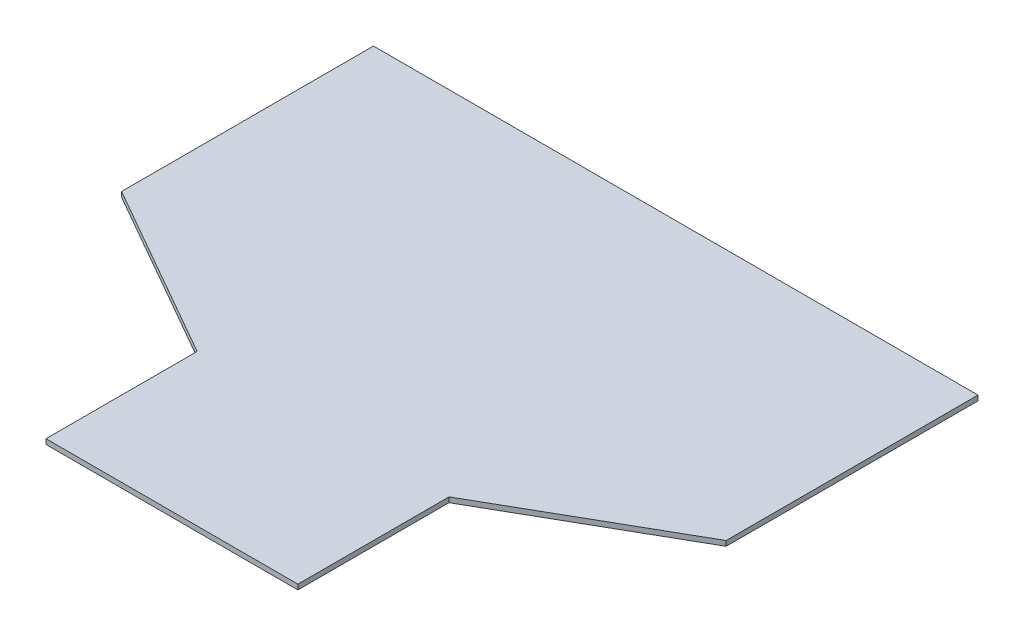
ISO-10303-21;
HEADER;
FILE_DESCRIPTION(('STEP AP214'),'2;1');
FILE_NAME('part.step','',(''),(''),'','','');
FILE_SCHEMA(('AUTOMOTIVE_DESIGN { 1 0 10303 214 1 1 1 1 }'));
ENDSEC;
DATA;
#1=APPLICATION_CONTEXT('core data for automotive mechanical design processes');
#2=APPLICATION_PROTOCOL_DEFINITION('international standard','automotive_design',2000,#1);
#3=PRODUCT_CONTEXT('',#1,'mechanical');
#4=PRODUCT('Part','Part','',(#3));
#5=PRODUCT_RELATED_PRODUCT_CATEGORY('part','',(#4));
#6=PRODUCT_DEFINITION_FORMATION('','',#4);
#7=PRODUCT_DEFINITION_CONTEXT('part definition',#1,'design');
#8=PRODUCT_DEFINITION('design','',#6,#7);
#9=PRODUCT_DEFINITION_SHAPE('','',#8);
#10=(LENGTH_UNIT() NAMED_UNIT(*) SI_UNIT(.MILLI.,.METRE.));
#11=(NAMED_UNIT(*) PLANE_ANGLE_UNIT() SI_UNIT($,.RADIAN.));
#12=(NAMED_UNIT(*) SI_UNIT($,.STERADIAN.) SOLID_ANGLE_UNIT());
#13=UNCERTAINTY_MEASURE_WITH_UNIT(LENGTH_MEASURE(1.E-05),#10,'distance_accuracy_value','');
#14=(GEOMETRIC_REPRESENTATION_CONTEXT(3) GLOBAL_UNCERTAINTY_ASSIGNED_CONTEXT((#13)) GLOBAL_UNIT_ASSIGNED_CONTEXT((#10,
#11,#12)) REPRESENTATION_CONTEXT('',''));
#15=CARTESIAN_POINT('',(0.,0.,0.));
#16=DIRECTION('',(0.,0.,1.));
#17=DIRECTION('',(1.,0.,0.));
#18=AXIS2_PLACEMENT_3D('',#15,#16,#17);
#19=CARTESIAN_POINT('',(-152.4,2.54,127.));
#20=DIRECTION('',(0.496138938356834,0.,-0.868243142124459));
#21=DIRECTION('',(-0.868243142124459,0.,-0.496138938356834));
#22=AXIS2_PLACEMENT_3D('',#19,#20,#21);
#23=PLANE('',#22);
#24=DIRECTION('',(0.868243142124459,0.,0.496138938356834));
#25=VECTOR('',#24,1.);
#26=CARTESIAN_POINT('',(-152.4,0.,127.));
#27=LINE('',#26,#25);
#28=CARTESIAN_POINT('',(-152.4,0.,127.));
#29=VERTEX_POINT('',#28);
#30=CARTESIAN_POINT('',(-63.5,0.,177.8));
#31=VERTEX_POINT('',#30);
#32=EDGE_CURVE('E129',#29,#31,#27,.T.);
#33=ORIENTED_EDGE('',*,*,#32,.T.);
#34=DIRECTION('',(0.,-1.,0.));
#35=VECTOR('',#34,1.);
#36=CARTESIAN_POINT('',(-63.5,2.54,177.8));
#37=LINE('',#36,#35);
#38=CARTESIAN_POINT('',(-63.5,2.54,177.8));
#39=VERTEX_POINT('',#38);
#40=EDGE_CURVE('E11',#39,#31,#37,.T.);
#41=ORIENTED_EDGE('',*,*,#40,.F.);
#42=DIRECTION('',(0.868243142124459,0.,0.496138938356834));
#43=VECTOR('',#42,1.);
#44=CARTESIAN_POINT('',(-152.4,2.54,127.));
#45=LINE('',#44,#43);
#46=CARTESIAN_POINT('',(-152.4,2.54,127.));
#47=VERTEX_POINT('',#46);
#48=EDGE_CURVE('E143',#47,#39,#45,.T.);
#49=ORIENTED_EDGE('',*,*,#48,.F.);
#50=DIRECTION('',(0.,-1.,0.));
#51=VECTOR('',#50,1.);
#52=CARTESIAN_POINT('',(-152.4,2.54,127.));
#53=LINE('',#52,#51);
#54=EDGE_CURVE('E125',#47,#29,#53,.T.);
#55=ORIENTED_EDGE('',*,*,#54,.T.);
#56=EDGE_LOOP('',(#33,#41,#49,#55));
#57=FACE_BOUND('',#56,.T.);
#58=ADVANCED_FACE('F33',(#57),#23,.F.);
#59=CARTESIAN_POINT('',(-63.5,2.54,177.8));
#60=DIRECTION('',(1.,0.,0.));
#61=DIRECTION('',(0.,0.,-1.));
#62=AXIS2_PLACEMENT_3D('',#59,#60,#61);
#63=PLANE('',#62);
#64=DIRECTION('',(0.,0.,1.));
#65=VECTOR('',#64,1.);
#66=CARTESIAN_POINT('',(-63.5,0.,177.8));
#67=LINE('',#66,#65);
#68=CARTESIAN_POINT('',(-63.5,0.,254.));
#69=VERTEX_POINT('',#68);
#70=EDGE_CURVE('E132',#31,#69,#67,.T.);
#71=ORIENTED_EDGE('',*,*,#70,.T.);
#72=DIRECTION('',(0.,-1.,0.));
#73=VECTOR('',#72,1.);
#74=CARTESIAN_POINT('',(-63.5,2.54,254.));
#75=LINE('',#74,#73);
#76=CARTESIAN_POINT('',(-63.5,2.54,254.));
#77=VERTEX_POINT('',#76);
#78=EDGE_CURVE('E41',#77,#69,#75,.T.);
#79=ORIENTED_EDGE('',*,*,#78,.F.);
#80=DIRECTION('',(0.,0.,1.));
#81=VECTOR('',#80,1.);
#82=CARTESIAN_POINT('',(-63.5,2.54,177.8));
#83=LINE('',#82,#81);
#84=EDGE_CURVE('E92',#39,#77,#83,.T.);
#85=ORIENTED_EDGE('',*,*,#84,.F.);
#86=ORIENTED_EDGE('',*,*,#40,.T.);
#87=EDGE_LOOP('',(#71,#79,#85,#86));
#88=FACE_BOUND('',#87,.T.);
#89=ADVANCED_FACE('F178',(#88),#63,.F.);
#90=CARTESIAN_POINT('',(-63.5,2.54,254.));
#91=DIRECTION('',(0.,0.,-1.));
#92=DIRECTION('',(-1.,0.,0.));
#93=AXIS2_PLACEMENT_3D('',#90,#91,#92);
#94=PLANE('',#93);
#95=DIRECTION('',(1.,0.,0.));
#96=VECTOR('',#95,1.);
#97=CARTESIAN_POINT('',(-63.5,0.,254.));
#98=LINE('',#97,#96);
#99=CARTESIAN_POINT('',(63.5000000000001,0.,254.));
#100=VERTEX_POINT('',#99);
#101=EDGE_CURVE('E134',#69,#100,#98,.T.);
#102=ORIENTED_EDGE('',*,*,#101,.T.);
#103=DIRECTION('',(0.,-1.,0.));
#104=VECTOR('',#103,1.);
#105=CARTESIAN_POINT('',(63.5000000000001,2.54,254.));
#106=LINE('',#105,#104);
#107=CARTESIAN_POINT('',(63.5000000000001,2.54,254.));
#108=VERTEX_POINT('',#107);
#109=EDGE_CURVE('E150',#108,#100,#106,.T.);
#110=ORIENTED_EDGE('',*,*,#109,.F.);
#111=DIRECTION('',(1.,0.,0.));
#112=VECTOR('',#111,1.);
#113=CARTESIAN_POINT('',(-63.5,2.54,254.));
#114=LINE('',#113,#112);
#115=EDGE_CURVE('E158',#77,#108,#114,.T.);
#116=ORIENTED_EDGE('',*,*,#115,.F.);
#117=ORIENTED_EDGE('',*,*,#78,.T.);
#118=EDGE_LOOP('',(#102,#110,#116,#117));
#119=FACE_BOUND('',#118,.T.);
#120=ADVANCED_FACE('F156',(#119),#94,.F.);
#121=CARTESIAN_POINT('',(63.5000000000001,2.54,254.));
#122=DIRECTION('',(-1.,0.,0.));
#123=DIRECTION('',(0.,0.,1.));
#124=AXIS2_PLACEMENT_3D('',#121,#122,#123);
#125=PLANE('',#124);
#126=DIRECTION('',(0.,0.,-1.));
#127=VECTOR('',#126,1.);
#128=CARTESIAN_POINT('',(63.5000000000001,0.,254.));
#129=LINE('',#128,#127);
#130=CARTESIAN_POINT('',(63.5000000000001,0.,177.8));
#131=VERTEX_POINT('',#130);
#132=EDGE_CURVE('E136',#100,#131,#129,.T.);
#133=ORIENTED_EDGE('',*,*,#132,.T.);
#134=DIRECTION('',(0.,-1.,0.));
#135=VECTOR('',#134,1.);
#136=CARTESIAN_POINT('',(63.5000000000001,2.54,177.8));
#137=LINE('',#136,#135);
#138=CARTESIAN_POINT('',(63.5000000000001,2.54,177.8));
#139=VERTEX_POINT('',#138);
#140=EDGE_CURVE('E147',#139,#131,#137,.T.);
#141=ORIENTED_EDGE('',*,*,#140,.F.);
#142=DIRECTION('',(0.,0.,-1.));
#143=VECTOR('',#142,1.);
#144=CARTESIAN_POINT('',(63.5000000000001,2.54,254.));
#145=LINE('',#144,#143);
#146=EDGE_CURVE('E170',#108,#139,#145,.T.);
#147=ORIENTED_EDGE('',*,*,#146,.F.);
#148=ORIENTED_EDGE('',*,*,#109,.T.);
#149=EDGE_LOOP('',(#133,#141,#147,#148));
#150=FACE_BOUND('',#149,.T.);
#151=ADVANCED_FACE('F166',(#150),#125,.F.);
#152=CARTESIAN_POINT('',(63.5000000000001,2.54,177.8));
#153=DIRECTION('',(-0.496138938356834,0.,-0.868243142124459));
#154=DIRECTION('',(-0.868243142124459,0.,0.496138938356834));
#155=AXIS2_PLACEMENT_3D('',#152,#153,#154);
#156=PLANE('',#155);
#157=DIRECTION('',(0.868243142124459,0.,-0.496138938356834));
#158=VECTOR('',#157,1.);
#159=CARTESIAN_POINT('',(63.5000000000001,0.,177.8));
#160=LINE('',#159,#158);
#161=CARTESIAN_POINT('',(152.4,0.,127.));
#162=VERTEX_POINT('',#161);
#163=EDGE_CURVE('E138',#131,#162,#160,.T.);
#164=ORIENTED_EDGE('',*,*,#163,.T.);
#165=DIRECTION('',(0.,-1.,0.));
#166=VECTOR('',#165,1.);
#167=CARTESIAN_POINT('',(152.4,2.54,127.));
#168=LINE('',#167,#166);
#169=CARTESIAN_POINT('',(152.4,2.54,127.));
#170=VERTEX_POINT('',#169);
#171=EDGE_CURVE('E120',#170,#162,#168,.T.);
#172=ORIENTED_EDGE('',*,*,#171,.F.);
#173=DIRECTION('',(0.868243142124459,0.,-0.496138938356834));
#174=VECTOR('',#173,1.);
#175=CARTESIAN_POINT('',(63.5000000000001,2.54,177.8));
#176=LINE('',#175,#174);
#177=EDGE_CURVE('E111',#139,#170,#176,.T.);
#178=ORIENTED_EDGE('',*,*,#177,.F.);
#179=ORIENTED_EDGE('',*,*,#140,.T.);
#180=EDGE_LOOP('',(#164,#172,#178,#179));
#181=FACE_BOUND('',#180,.T.);
#182=ADVANCED_FACE('F169',(#181),#156,.F.);
#183=CARTESIAN_POINT('',(152.4,2.54,127.));
#184=DIRECTION('',(-1.,0.,0.));
#185=DIRECTION('',(0.,0.,1.));
#186=AXIS2_PLACEMENT_3D('',#183,#184,#185);
#187=PLANE('',#186);
#188=DIRECTION('',(0.,0.,-1.));
#189=VECTOR('',#188,1.);
#190=CARTESIAN_POINT('',(152.4,0.,127.));
#191=LINE('',#190,#189);
#192=CARTESIAN_POINT('',(152.4,0.,0.));
#193=VERTEX_POINT('',#192);
#194=EDGE_CURVE('E119',#162,#193,#191,.T.);
#195=ORIENTED_EDGE('',*,*,#194,.T.);
#196=DIRECTION('',(0.,-1.,0.));
#197=VECTOR('',#196,1.);
#198=CARTESIAN_POINT('',(152.4,2.54,0.));
#199=LINE('',#198,#197);
#200=CARTESIAN_POINT('',(152.4,2.54,0.));
#201=VERTEX_POINT('',#200);
#202=EDGE_CURVE('E116',#201,#193,#199,.T.);
#203=ORIENTED_EDGE('',*,*,#202,.F.);
#204=DIRECTION('',(0.,0.,-1.));
#205=VECTOR('',#204,1.);
#206=CARTESIAN_POINT('',(152.4,2.54,127.));
#207=LINE('',#206,#205);
#208=EDGE_CURVE('E105',#170,#201,#207,.T.);
#209=ORIENTED_EDGE('',*,*,#208,.F.);
#210=ORIENTED_EDGE('',*,*,#171,.T.);
#211=EDGE_LOOP('',(#195,#203,#209,#210));
#212=FACE_BOUND('',#211,.T.);
#213=ADVANCED_FACE('F117',(#212),#187,.F.);
#214=CARTESIAN_POINT('',(-152.4,2.54,0.));
#215=DIRECTION('',(0.,0.,1.));
#216=DIRECTION('',(1.,0.,0.));
#217=AXIS2_PLACEMENT_3D('',#214,#215,#216);
#218=PLANE('',#217);
#219=DIRECTION('',(-1.,0.,0.));
#220=VECTOR('',#219,1.);
#221=CARTESIAN_POINT('',(-152.4,0.,0.));
#222=LINE('',#221,#220);
#223=CARTESIAN_POINT('',(-152.4,0.,0.));
#224=VERTEX_POINT('',#223);
#225=EDGE_CURVE('E78',#193,#224,#222,.T.);
#226=ORIENTED_EDGE('',*,*,#225,.T.);
#227=DIRECTION('',(0.,-1.,0.));
#228=VECTOR('',#227,1.);
#229=CARTESIAN_POINT('',(-152.4,2.54,0.));
#230=LINE('',#229,#228);
#231=CARTESIAN_POINT('',(-152.4,2.54,0.));
#232=VERTEX_POINT('',#231);
#233=EDGE_CURVE('E121',#232,#224,#230,.T.);
#234=ORIENTED_EDGE('',*,*,#233,.F.);
#235=DIRECTION('',(-1.,0.,0.));
#236=VECTOR('',#235,1.);
#237=CARTESIAN_POINT('',(-152.4,2.54,0.));
#238=LINE('',#237,#236);
#239=EDGE_CURVE('E109',#201,#232,#238,.T.);
#240=ORIENTED_EDGE('',*,*,#239,.F.);
#241=ORIENTED_EDGE('',*,*,#202,.T.);
#242=EDGE_LOOP('',(#226,#234,#240,#241));
#243=FACE_BOUND('',#242,.T.);
#244=ADVANCED_FACE('F123',(#243),#218,.F.);
#245=CARTESIAN_POINT('',(-152.4,2.54,0.));
#246=DIRECTION('',(1.,0.,0.));
#247=DIRECTION('',(0.,0.,-1.));
#248=AXIS2_PLACEMENT_3D('',#245,#246,#247);
#249=PLANE('',#248);
#250=DIRECTION('',(0.,0.,1.));
#251=VECTOR('',#250,1.);
#252=CARTESIAN_POINT('',(-152.4,0.,0.));
#253=LINE('',#252,#251);
#254=EDGE_CURVE('E84',#224,#29,#253,.T.);
#255=ORIENTED_EDGE('',*,*,#254,.T.);
#256=ORIENTED_EDGE('',*,*,#54,.F.);
#257=DIRECTION('',(0.,0.,1.));
#258=VECTOR('',#257,1.);
#259=CARTESIAN_POINT('',(-152.4,2.54,0.));
#260=LINE('',#259,#258);
#261=EDGE_CURVE('E49',#232,#47,#260,.T.);
#262=ORIENTED_EDGE('',*,*,#261,.F.);
#263=ORIENTED_EDGE('',*,*,#233,.T.);
#264=EDGE_LOOP('',(#255,#256,#262,#263));
#265=FACE_BOUND('',#264,.T.);
#266=ADVANCED_FACE('F194',(#265),#249,.F.);
#267=CARTESIAN_POINT('',(0.,2.54,0.));
#268=DIRECTION('',(0.,-1.,0.));
#269=DIRECTION('',(0.,0.,-1.));
#270=AXIS2_PLACEMENT_3D('',#267,#268,#269);
#271=PLANE('',#270);
#272=ORIENTED_EDGE('',*,*,#48,.T.);
#273=ORIENTED_EDGE('',*,*,#84,.T.);
#274=ORIENTED_EDGE('',*,*,#115,.T.);
#275=ORIENTED_EDGE('',*,*,#146,.T.);
#276=ORIENTED_EDGE('',*,*,#177,.T.);
#277=ORIENTED_EDGE('',*,*,#208,.T.);
#278=ORIENTED_EDGE('',*,*,#239,.T.);
#279=ORIENTED_EDGE('',*,*,#261,.T.);
#280=EDGE_LOOP('',(#272,#273,#274,#275,#276,#277,#278,#279));
#281=FACE_BOUND('',#280,.T.);
#282=ADVANCED_FACE('F107',(#281),#271,.F.);
#283=CARTESIAN_POINT('',(0.,0.,0.));
#284=DIRECTION('',(0.,-1.,0.));
#285=DIRECTION('',(0.,0.,-1.));
#286=AXIS2_PLACEMENT_3D('',#283,#284,#285);
#287=PLANE('',#286);
#288=ORIENTED_EDGE('',*,*,#32,.F.);
#289=ORIENTED_EDGE('',*,*,#254,.F.);
#290=ORIENTED_EDGE('',*,*,#225,.F.);
#291=ORIENTED_EDGE('',*,*,#194,.F.);
#292=ORIENTED_EDGE('',*,*,#163,.F.);
#293=ORIENTED_EDGE('',*,*,#132,.F.);
#294=ORIENTED_EDGE('',*,*,#101,.F.);
#295=ORIENTED_EDGE('',*,*,#70,.F.);
#296=EDGE_LOOP('',(#288,#289,#290,#291,#292,#293,#294,#295));
#297=FACE_BOUND('',#296,.T.);
#298=ADVANCED_FACE('F162',(#297),#287,.T.);
#299=CLOSED_SHELL('',(#58,#89,#120,#151,#182,#213,#244,#266,#282,#298));
#300=MANIFOLD_SOLID_BREP('B2',#299);
#301=ADVANCED_BREP_SHAPE_REPRESENTATION('',(#18,#300),#14);
#302=SHAPE_DEFINITION_REPRESENTATION(#9,#301);
ENDSEC;
END-ISO-10303-21;
